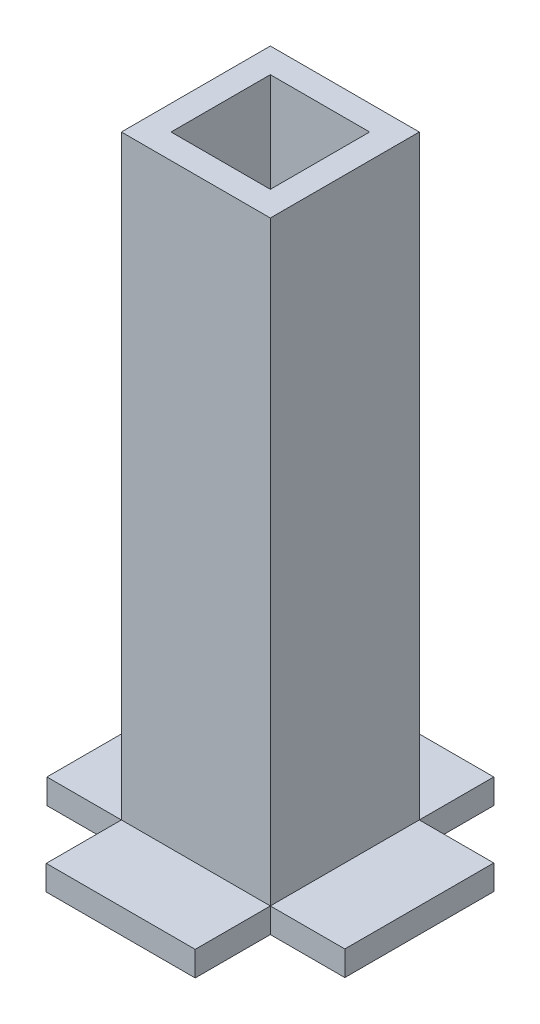
ISO-10303-21;
HEADER;
FILE_DESCRIPTION(('STEP AP214'),'2;1');
FILE_NAME('part.step','',(''),(''),'','','');
FILE_SCHEMA(('AUTOMOTIVE_DESIGN { 1 0 10303 214 1 1 1 1 }'));
ENDSEC;
DATA;
#1=APPLICATION_CONTEXT('core data for automotive mechanical design processes');
#2=APPLICATION_PROTOCOL_DEFINITION('international standard','automotive_design',2000,#1);
#3=PRODUCT_CONTEXT('',#1,'mechanical');
#4=PRODUCT('Part','Part','',(#3));
#5=PRODUCT_RELATED_PRODUCT_CATEGORY('part','',(#4));
#6=PRODUCT_DEFINITION_FORMATION('','',#4);
#7=PRODUCT_DEFINITION_CONTEXT('part definition',#1,'design');
#8=PRODUCT_DEFINITION('design','',#6,#7);
#9=PRODUCT_DEFINITION_SHAPE('','',#8);
#10=(LENGTH_UNIT() NAMED_UNIT(*) SI_UNIT(.MILLI.,.METRE.));
#11=(NAMED_UNIT(*) PLANE_ANGLE_UNIT() SI_UNIT($,.RADIAN.));
#12=(NAMED_UNIT(*) SI_UNIT($,.STERADIAN.) SOLID_ANGLE_UNIT());
#13=UNCERTAINTY_MEASURE_WITH_UNIT(LENGTH_MEASURE(1.E-05),#10,'distance_accuracy_value','');
#14=(GEOMETRIC_REPRESENTATION_CONTEXT(3) GLOBAL_UNCERTAINTY_ASSIGNED_CONTEXT((#13)) GLOBAL_UNIT_ASSIGNED_CONTEXT((#10,
#11,#12)) REPRESENTATION_CONTEXT('',''));
#15=CARTESIAN_POINT('',(0.,0.,0.));
#16=DIRECTION('',(0.,0.,1.));
#17=DIRECTION('',(1.,0.,0.));
#18=AXIS2_PLACEMENT_3D('',#15,#16,#17);
#19=CARTESIAN_POINT('',(0.,250.,0.));
#20=DIRECTION('',(0.,0.,-1.));
#21=DIRECTION('',(-1.,0.,0.));
#22=AXIS2_PLACEMENT_3D('',#19,#20,#21);
#23=PLANE('',#22);
#24=DIRECTION('',(0.,-1.,0.));
#25=VECTOR('',#24,1.);
#26=CARTESIAN_POINT('',(0.,10.,0.));
#27=LINE('',#26,#25);
#28=CARTESIAN_POINT('',(0.,10.,0.));
#29=VERTEX_POINT('',#28);
#30=CARTESIAN_POINT('',(0.,0.,0.));
#31=VERTEX_POINT('',#30);
#32=EDGE_CURVE('E202',#29,#31,#27,.T.);
#33=ORIENTED_EDGE('',*,*,#32,.F.);
#34=DIRECTION('',(-1.,0.,0.));
#35=VECTOR('',#34,1.);
#36=CARTESIAN_POINT('',(0.,10.,0.));
#37=LINE('',#36,#35);
#38=CARTESIAN_POINT('',(-30.,10.,0.));
#39=VERTEX_POINT('',#38);
#40=EDGE_CURVE('E241',#29,#39,#37,.T.);
#41=ORIENTED_EDGE('',*,*,#40,.T.);
#42=DIRECTION('',(0.,-1.,0.));
#43=VECTOR('',#42,1.);
#44=CARTESIAN_POINT('',(-30.,10.,0.));
#45=LINE('',#44,#43);
#46=CARTESIAN_POINT('',(-30.,0.,0.));
#47=VERTEX_POINT('',#46);
#48=EDGE_CURVE('E243',#39,#47,#45,.T.);
#49=ORIENTED_EDGE('',*,*,#48,.T.);
#50=DIRECTION('',(1.,0.,0.));
#51=VECTOR('',#50,1.);
#52=CARTESIAN_POINT('',(0.,0.,0.));
#53=LINE('',#52,#51);
#54=EDGE_CURVE('E358',#47,#31,#53,.T.);
#55=ORIENTED_EDGE('',*,*,#54,.T.);
#56=EDGE_LOOP('',(#33,#41,#49,#55));
#57=FACE_BOUND('',#56,.T.);
#58=ADVANCED_FACE('F35',(#57),#23,.F.);
#59=DIRECTION('',(0.,-1.,0.));
#60=VECTOR('',#59,1.);
#61=CARTESIAN_POINT('',(0.,250.,0.));
#62=LINE('',#61,#60);
#63=CARTESIAN_POINT('',(0.,250.,0.));
#64=VERTEX_POINT('',#63);
#65=EDGE_CURVE('E44',#64,#29,#62,.T.);
#66=ORIENTED_EDGE('',*,*,#65,.T.);
#67=DIRECTION('',(1.,0.,0.));
#68=VECTOR('',#67,1.);
#69=CARTESIAN_POINT('',(0.,10.,0.));
#70=LINE('',#69,#68);
#71=CARTESIAN_POINT('',(60.,10.,0.));
#72=VERTEX_POINT('',#71);
#73=EDGE_CURVE('E207',#29,#72,#70,.T.);
#74=ORIENTED_EDGE('',*,*,#73,.T.);
#75=DIRECTION('',(0.,-1.,0.));
#76=VECTOR('',#75,1.);
#77=CARTESIAN_POINT('',(60.,250.,0.));
#78=LINE('',#77,#76);
#79=CARTESIAN_POINT('',(60.,250.,0.));
#80=VERTEX_POINT('',#79);
#81=EDGE_CURVE('E363',#80,#72,#78,.T.);
#82=ORIENTED_EDGE('',*,*,#81,.F.);
#83=DIRECTION('',(1.,0.,0.));
#84=VECTOR('',#83,1.);
#85=CARTESIAN_POINT('',(0.,250.,0.));
#86=LINE('',#85,#84);
#87=EDGE_CURVE('E351',#64,#80,#86,.T.);
#88=ORIENTED_EDGE('',*,*,#87,.F.);
#89=EDGE_LOOP('',(#66,#74,#82,#88));
#90=FACE_BOUND('',#89,.T.);
#91=ADVANCED_FACE('F406',(#90),#23,.F.);
#92=CARTESIAN_POINT('',(60.,250.,0.));
#93=DIRECTION('',(-1.,0.,0.));
#94=DIRECTION('',(0.,0.,1.));
#95=AXIS2_PLACEMENT_3D('',#92,#93,#94);
#96=PLANE('',#95);
#97=DIRECTION('',(0.,0.,1.));
#98=VECTOR('',#97,1.);
#99=CARTESIAN_POINT('',(60.,10.,0.));
#100=LINE('',#99,#98);
#101=CARTESIAN_POINT('',(60.,10.,-60.));
#102=VERTEX_POINT('',#101);
#103=EDGE_CURVE('E220',#102,#72,#100,.T.);
#104=ORIENTED_EDGE('',*,*,#103,.F.);
#105=DIRECTION('',(0.,-1.,0.));
#106=VECTOR('',#105,1.);
#107=CARTESIAN_POINT('',(60.,250.,-60.));
#108=LINE('',#107,#106);
#109=CARTESIAN_POINT('',(60.,250.,-60.));
#110=VERTEX_POINT('',#109);
#111=EDGE_CURVE('E39',#110,#102,#108,.T.);
#112=ORIENTED_EDGE('',*,*,#111,.F.);
#113=DIRECTION('',(0.,0.,-1.));
#114=VECTOR('',#113,1.);
#115=CARTESIAN_POINT('',(60.,250.,0.));
#116=LINE('',#115,#114);
#117=EDGE_CURVE('E348',#80,#110,#116,.T.);
#118=ORIENTED_EDGE('',*,*,#117,.F.);
#119=ORIENTED_EDGE('',*,*,#81,.T.);
#120=EDGE_LOOP('',(#104,#112,#118,#119));
#121=FACE_BOUND('',#120,.T.);
#122=ADVANCED_FACE('F410',(#121),#96,.F.);
#123=CARTESIAN_POINT('',(0.,250.,0.));
#124=DIRECTION('',(-1.,0.,0.));
#125=DIRECTION('',(0.,0.,1.));
#126=AXIS2_PLACEMENT_3D('',#123,#124,#125);
#127=PLANE('',#126);
#128=CARTESIAN_POINT('',(0.,173.5,-25.5));
#129=DIRECTION('',(-1.,0.,0.));
#130=DIRECTION('',(0.,0.,1.));
#131=AXIS2_PLACEMENT_3D('',#128,#129,#130);
#132=CIRCLE('',#131,2.00000000000001);
#133=CARTESIAN_POINT('',(0.,173.5,-23.5));
#134=VERTEX_POINT('',#133);
#135=EDGE_CURVE('E789',#134,#134,#132,.T.);
#136=ORIENTED_EDGE('',*,*,#135,.F.);
#137=EDGE_LOOP('',(#136));
#138=FACE_BOUND('',#137,.T.);
#139=CARTESIAN_POINT('',(0.,125.5,-34.5));
#140=DIRECTION('',(-1.,0.,0.));
#141=DIRECTION('',(0.,0.,1.));
#142=AXIS2_PLACEMENT_3D('',#139,#140,#141);
#143=CIRCLE('',#142,2.);
#144=CARTESIAN_POINT('',(0.,125.5,-32.5));
#145=VERTEX_POINT('',#144);
#146=EDGE_CURVE('E782',#145,#145,#143,.T.);
#147=ORIENTED_EDGE('',*,*,#146,.F.);
#148=EDGE_LOOP('',(#147));
#149=FACE_BOUND('',#148,.T.);
#150=CARTESIAN_POINT('',(0.,125.5,-25.5));
#151=DIRECTION('',(-1.,0.,0.));
#152=DIRECTION('',(0.,0.,1.));
#153=AXIS2_PLACEMENT_3D('',#150,#151,#152);
#154=CIRCLE('',#153,1.99999999999999);
#155=CARTESIAN_POINT('',(0.,125.5,-23.5));
#156=VERTEX_POINT('',#155);
#157=EDGE_CURVE('E794',#156,#156,#154,.T.);
#158=ORIENTED_EDGE('',*,*,#157,.F.);
#159=EDGE_LOOP('',(#158));
#160=FACE_BOUND('',#159,.T.);
#161=CARTESIAN_POINT('',(0.,173.5,-34.5));
#162=DIRECTION('',(-1.,0.,0.));
#163=DIRECTION('',(0.,0.,1.));
#164=AXIS2_PLACEMENT_3D('',#161,#162,#163);
#165=CIRCLE('',#164,2.);
#166=CARTESIAN_POINT('',(0.,173.5,-32.5));
#167=VERTEX_POINT('',#166);
#168=EDGE_CURVE('E774',#167,#167,#165,.T.);
#169=ORIENTED_EDGE('',*,*,#168,.F.);
#170=EDGE_LOOP('',(#169));
#171=FACE_BOUND('',#170,.T.);
#172=DIRECTION('',(0.,0.,-1.));
#173=VECTOR('',#172,1.);
#174=CARTESIAN_POINT('',(0.,129.,-40.));
#175=LINE('',#174,#173);
#176=CARTESIAN_POINT('',(0.,129.,-20.));
#177=VERTEX_POINT('',#176);
#178=CARTESIAN_POINT('',(0.,129.,-40.));
#179=VERTEX_POINT('',#178);
#180=EDGE_CURVE('E286',#177,#179,#175,.T.);
#181=ORIENTED_EDGE('',*,*,#180,.T.);
#182=DIRECTION('',(0.,1.,0.));
#183=VECTOR('',#182,1.);
#184=CARTESIAN_POINT('',(0.,170.,-40.));
#185=LINE('',#184,#183);
#186=CARTESIAN_POINT('',(0.,170.,-40.));
#187=VERTEX_POINT('',#186);
#188=EDGE_CURVE('E282',#179,#187,#185,.T.);
#189=ORIENTED_EDGE('',*,*,#188,.T.);
#190=DIRECTION('',(0.,0.,1.));
#191=VECTOR('',#190,1.);
#192=CARTESIAN_POINT('',(0.,170.,-40.));
#193=LINE('',#192,#191);
#194=CARTESIAN_POINT('',(0.,170.,-20.));
#195=VERTEX_POINT('',#194);
#196=EDGE_CURVE('E296',#187,#195,#193,.T.);
#197=ORIENTED_EDGE('',*,*,#196,.T.);
#198=DIRECTION('',(0.,-1.,0.));
#199=VECTOR('',#198,1.);
#200=CARTESIAN_POINT('',(0.,170.,-20.));
#201=LINE('',#200,#199);
#202=EDGE_CURVE('E299',#195,#177,#201,.T.);
#203=ORIENTED_EDGE('',*,*,#202,.T.);
#204=EDGE_LOOP('',(#181,#189,#197,#203));
#205=FACE_BOUND('',#204,.T.);
#206=DIRECTION('',(0.,-1.,0.));
#207=VECTOR('',#206,1.);
#208=CARTESIAN_POINT('',(0.,250.,-60.));
#209=LINE('',#208,#207);
#210=CARTESIAN_POINT('',(0.,250.,-60.));
#211=VERTEX_POINT('',#210);
#212=CARTESIAN_POINT('',(0.,10.,-60.));
#213=VERTEX_POINT('',#212);
#214=EDGE_CURVE('E11',#211,#213,#209,.T.);
#215=ORIENTED_EDGE('',*,*,#214,.T.);
#216=DIRECTION('',(0.,0.,1.));
#217=VECTOR('',#216,1.);
#218=CARTESIAN_POINT('',(0.,10.,0.));
#219=LINE('',#218,#217);
#220=EDGE_CURVE('E246',#213,#29,#219,.T.);
#221=ORIENTED_EDGE('',*,*,#220,.T.);
#222=ORIENTED_EDGE('',*,*,#65,.F.);
#223=DIRECTION('',(0.,0.,-1.));
#224=VECTOR('',#223,1.);
#225=CARTESIAN_POINT('',(0.,250.,0.));
#226=LINE('',#225,#224);
#227=EDGE_CURVE('E353',#64,#211,#226,.T.);
#228=ORIENTED_EDGE('',*,*,#227,.T.);
#229=EDGE_LOOP('',(#215,#221,#222,#228));
#230=FACE_BOUND('',#229,.T.);
#231=ADVANCED_FACE('F403',(#138,#149,#160,#171,#205,#230),#127,.T.);
#232=DIRECTION('',(0.,-1.,0.));
#233=VECTOR('',#232,1.);
#234=CARTESIAN_POINT('',(0.,10.,-60.));
#235=LINE('',#234,#233);
#236=CARTESIAN_POINT('',(0.,0.,-60.));
#237=VERTEX_POINT('',#236);
#238=EDGE_CURVE('E247',#213,#237,#235,.T.);
#239=ORIENTED_EDGE('',*,*,#238,.F.);
#240=DIRECTION('',(0.,0.,-1.));
#241=VECTOR('',#240,1.);
#242=CARTESIAN_POINT('',(0.,10.,0.));
#243=LINE('',#242,#241);
#244=CARTESIAN_POINT('',(0.,10.,-90.));
#245=VERTEX_POINT('',#244);
#246=EDGE_CURVE('E271',#213,#245,#243,.T.);
#247=ORIENTED_EDGE('',*,*,#246,.T.);
#248=DIRECTION('',(0.,-1.,0.));
#249=VECTOR('',#248,1.);
#250=CARTESIAN_POINT('',(0.,10.,-90.));
#251=LINE('',#250,#249);
#252=CARTESIAN_POINT('',(0.,0.,-90.));
#253=VERTEX_POINT('',#252);
#254=EDGE_CURVE('E274',#245,#253,#251,.T.);
#255=ORIENTED_EDGE('',*,*,#254,.T.);
#256=DIRECTION('',(0.,0.,-1.));
#257=VECTOR('',#256,1.);
#258=CARTESIAN_POINT('',(0.,0.,0.));
#259=LINE('',#258,#257);
#260=EDGE_CURVE('E349',#237,#253,#259,.T.);
#261=ORIENTED_EDGE('',*,*,#260,.F.);
#262=EDGE_LOOP('',(#239,#247,#255,#261));
#263=FACE_BOUND('',#262,.T.);
#264=ADVANCED_FACE('F385',(#263),#127,.T.);
#265=CARTESIAN_POINT('',(9.99999999999999,0.,-50.));
#266=DIRECTION('',(-1.,0.,0.));
#267=DIRECTION('',(0.,0.,1.));
#268=AXIS2_PLACEMENT_3D('',#265,#266,#267);
#269=PLANE('',#268);
#270=CARTESIAN_POINT('',(10.,173.5,-25.5));
#271=DIRECTION('',(-1.,0.,0.));
#272=DIRECTION('',(0.,0.,1.));
#273=AXIS2_PLACEMENT_3D('',#270,#271,#272);
#274=CIRCLE('',#273,2.00000000000001);
#275=CARTESIAN_POINT('',(10.,173.5,-23.5));
#276=VERTEX_POINT('',#275);
#277=EDGE_CURVE('E779',#276,#276,#274,.T.);
#278=ORIENTED_EDGE('',*,*,#277,.T.);
#279=EDGE_LOOP('',(#278));
#280=FACE_BOUND('',#279,.T.);
#281=CARTESIAN_POINT('',(10.,125.5,-34.5));
#282=DIRECTION('',(-1.,0.,0.));
#283=DIRECTION('',(0.,0.,1.));
#284=AXIS2_PLACEMENT_3D('',#281,#282,#283);
#285=CIRCLE('',#284,2.);
#286=CARTESIAN_POINT('',(10.,125.5,-32.5));
#287=VERTEX_POINT('',#286);
#288=EDGE_CURVE('E785',#287,#287,#285,.T.);
#289=ORIENTED_EDGE('',*,*,#288,.T.);
#290=EDGE_LOOP('',(#289));
#291=FACE_BOUND('',#290,.T.);
#292=CARTESIAN_POINT('',(10.,125.5,-25.5));
#293=DIRECTION('',(-1.,0.,0.));
#294=DIRECTION('',(0.,0.,1.));
#295=AXIS2_PLACEMENT_3D('',#292,#293,#294);
#296=CIRCLE('',#295,1.99999999999999);
#297=CARTESIAN_POINT('',(10.,125.5,-23.5));
#298=VERTEX_POINT('',#297);
#299=EDGE_CURVE('E786',#298,#298,#296,.T.);
#300=ORIENTED_EDGE('',*,*,#299,.T.);
#301=EDGE_LOOP('',(#300));
#302=FACE_BOUND('',#301,.T.);
#303=CARTESIAN_POINT('',(10.,173.5,-34.5));
#304=DIRECTION('',(-1.,0.,0.));
#305=DIRECTION('',(0.,0.,1.));
#306=AXIS2_PLACEMENT_3D('',#303,#304,#305);
#307=CIRCLE('',#306,2.);
#308=CARTESIAN_POINT('',(10.,173.5,-32.5));
#309=VERTEX_POINT('',#308);
#310=EDGE_CURVE('E772',#309,#309,#307,.T.);
#311=ORIENTED_EDGE('',*,*,#310,.T.);
#312=EDGE_LOOP('',(#311));
#313=FACE_BOUND('',#312,.T.);
#314=DIRECTION('',(0.,0.,1.));
#315=VECTOR('',#314,1.);
#316=CARTESIAN_POINT('',(9.99999999999999,250.,-50.));
#317=LINE('',#316,#315);
#318=CARTESIAN_POINT('',(9.99999999999999,250.,-50.));
#319=VERTEX_POINT('',#318);
#320=CARTESIAN_POINT('',(10.,250.,-10.));
#321=VERTEX_POINT('',#320);
#322=EDGE_CURVE('E318',#319,#321,#317,.T.);
#323=ORIENTED_EDGE('',*,*,#322,.T.);
#324=DIRECTION('',(0.,1.,0.));
#325=VECTOR('',#324,1.);
#326=CARTESIAN_POINT('',(10.,0.,-10.));
#327=LINE('',#326,#325);
#328=CARTESIAN_POINT('',(10.,0.,-10.));
#329=VERTEX_POINT('',#328);
#330=EDGE_CURVE('E336',#329,#321,#327,.T.);
#331=ORIENTED_EDGE('',*,*,#330,.F.);
#332=DIRECTION('',(0.,0.,1.));
#333=VECTOR('',#332,1.);
#334=CARTESIAN_POINT('',(9.99999999999999,0.,-50.));
#335=LINE('',#334,#333);
#336=CARTESIAN_POINT('',(9.99999999999999,0.,-50.));
#337=VERTEX_POINT('',#336);
#338=EDGE_CURVE('E323',#337,#329,#335,.T.);
#339=ORIENTED_EDGE('',*,*,#338,.F.);
#340=DIRECTION('',(0.,1.,0.));
#341=VECTOR('',#340,1.);
#342=CARTESIAN_POINT('',(9.99999999999999,0.,-50.));
#343=LINE('',#342,#341);
#344=EDGE_CURVE('E339',#337,#319,#343,.T.);
#345=ORIENTED_EDGE('',*,*,#344,.T.);
#346=EDGE_LOOP('',(#323,#331,#339,#345));
#347=FACE_BOUND('',#346,.T.);
#348=DIRECTION('',(0.,1.,0.));
#349=VECTOR('',#348,1.);
#350=CARTESIAN_POINT('',(10.,170.,-40.));
#351=LINE('',#350,#349);
#352=CARTESIAN_POINT('',(10.,129.,-40.));
#353=VERTEX_POINT('',#352);
#354=CARTESIAN_POINT('',(10.,170.,-40.));
#355=VERTEX_POINT('',#354);
#356=EDGE_CURVE('E283',#353,#355,#351,.T.);
#357=ORIENTED_EDGE('',*,*,#356,.F.);
#358=DIRECTION('',(0.,0.,-1.));
#359=VECTOR('',#358,1.);
#360=CARTESIAN_POINT('',(10.,129.,-40.));
#361=LINE('',#360,#359);
#362=CARTESIAN_POINT('',(10.,129.,-20.));
#363=VERTEX_POINT('',#362);
#364=EDGE_CURVE('E291',#363,#353,#361,.T.);
#365=ORIENTED_EDGE('',*,*,#364,.F.);
#366=DIRECTION('',(0.,-1.,0.));
#367=VECTOR('',#366,1.);
#368=CARTESIAN_POINT('',(10.,170.,-20.));
#369=LINE('',#368,#367);
#370=CARTESIAN_POINT('',(10.,170.,-20.));
#371=VERTEX_POINT('',#370);
#372=EDGE_CURVE('E288',#371,#363,#369,.T.);
#373=ORIENTED_EDGE('',*,*,#372,.F.);
#374=DIRECTION('',(0.,0.,1.));
#375=VECTOR('',#374,1.);
#376=CARTESIAN_POINT('',(10.,170.,-40.));
#377=LINE('',#376,#375);
#378=EDGE_CURVE('E285',#355,#371,#377,.T.);
#379=ORIENTED_EDGE('',*,*,#378,.F.);
#380=EDGE_LOOP('',(#357,#365,#373,#379));
#381=FACE_BOUND('',#380,.T.);
#382=ADVANCED_FACE('F433',(#280,#291,#302,#313,#347,#381),#269,.F.);
#383=CARTESIAN_POINT('',(0.,250.,-60.));
#384=DIRECTION('',(0.,0.,-1.));
#385=DIRECTION('',(-1.,0.,0.));
#386=AXIS2_PLACEMENT_3D('',#383,#384,#385);
#387=PLANE('',#386);
#388=DIRECTION('',(1.,0.,0.));
#389=VECTOR('',#388,1.);
#390=CARTESIAN_POINT('',(0.,10.,-60.));
#391=LINE('',#390,#389);
#392=EDGE_CURVE('E263',#213,#102,#391,.T.);
#393=ORIENTED_EDGE('',*,*,#392,.F.);
#394=ORIENTED_EDGE('',*,*,#214,.F.);
#395=DIRECTION('',(1.,0.,0.));
#396=VECTOR('',#395,1.);
#397=CARTESIAN_POINT('',(0.,250.,-60.));
#398=LINE('',#397,#396);
#399=EDGE_CURVE('E345',#211,#110,#398,.T.);
#400=ORIENTED_EDGE('',*,*,#399,.T.);
#401=ORIENTED_EDGE('',*,*,#111,.T.);
#402=EDGE_LOOP('',(#393,#394,#400,#401));
#403=FACE_BOUND('',#402,.T.);
#404=ADVANCED_FACE('F37',(#403),#387,.T.);
#405=DIRECTION('',(1.,0.,0.));
#406=VECTOR('',#405,1.);
#407=CARTESIAN_POINT('',(0.,10.,0.));
#408=LINE('',#407,#406);
#409=CARTESIAN_POINT('',(90.,10.,0.));
#410=VERTEX_POINT('',#409);
#411=EDGE_CURVE('E230',#72,#410,#408,.T.);
#412=ORIENTED_EDGE('',*,*,#411,.F.);
#413=DIRECTION('',(0.,-1.,0.));
#414=VECTOR('',#413,1.);
#415=CARTESIAN_POINT('',(60.,10.,0.));
#416=LINE('',#415,#414);
#417=CARTESIAN_POINT('',(60.,0.,0.));
#418=VERTEX_POINT('',#417);
#419=EDGE_CURVE('E190',#72,#418,#416,.T.);
#420=ORIENTED_EDGE('',*,*,#419,.T.);
#421=CARTESIAN_POINT('',(90.,0.,0.));
#422=VERTEX_POINT('',#421);
#423=EDGE_CURVE('E357',#418,#422,#53,.T.);
#424=ORIENTED_EDGE('',*,*,#423,.T.);
#425=DIRECTION('',(0.,-1.,0.));
#426=VECTOR('',#425,1.);
#427=CARTESIAN_POINT('',(90.,10.,0.));
#428=LINE('',#427,#426);
#429=EDGE_CURVE('E221',#410,#422,#428,.T.);
#430=ORIENTED_EDGE('',*,*,#429,.F.);
#431=EDGE_LOOP('',(#412,#420,#424,#430));
#432=FACE_BOUND('',#431,.T.);
#433=ADVANCED_FACE('F419',(#432),#23,.F.);
#434=DIRECTION('',(0.,0.,-1.));
#435=VECTOR('',#434,1.);
#436=CARTESIAN_POINT('',(60.,10.,0.));
#437=LINE('',#436,#435);
#438=CARTESIAN_POINT('',(60.,10.,-90.));
#439=VERTEX_POINT('',#438);
#440=EDGE_CURVE('E266',#102,#439,#437,.T.);
#441=ORIENTED_EDGE('',*,*,#440,.F.);
#442=DIRECTION('',(0.,-1.,0.));
#443=VECTOR('',#442,1.);
#444=CARTESIAN_POINT('',(60.,10.,-60.));
#445=LINE('',#444,#443);
#446=CARTESIAN_POINT('',(60.,0.,-60.));
#447=VERTEX_POINT('',#446);
#448=EDGE_CURVE('E217',#102,#447,#445,.T.);
#449=ORIENTED_EDGE('',*,*,#448,.T.);
#450=DIRECTION('',(0.,0.,-1.));
#451=VECTOR('',#450,1.);
#452=CARTESIAN_POINT('',(60.,0.,0.));
#453=LINE('',#452,#451);
#454=CARTESIAN_POINT('',(60.,0.,-90.));
#455=VERTEX_POINT('',#454);
#456=EDGE_CURVE('E338',#447,#455,#453,.T.);
#457=ORIENTED_EDGE('',*,*,#456,.T.);
#458=DIRECTION('',(0.,-1.,0.));
#459=VECTOR('',#458,1.);
#460=CARTESIAN_POINT('',(60.,10.,-90.));
#461=LINE('',#460,#459);
#462=EDGE_CURVE('E279',#439,#455,#461,.T.);
#463=ORIENTED_EDGE('',*,*,#462,.F.);
#464=EDGE_LOOP('',(#441,#449,#457,#463));
#465=FACE_BOUND('',#464,.T.);
#466=ADVANCED_FACE('F377',(#465),#96,.F.);
#467=CARTESIAN_POINT('',(0.,250.,0.));
#468=DIRECTION('',(0.,1.,0.));
#469=DIRECTION('',(0.,0.,1.));
#470=AXIS2_PLACEMENT_3D('',#467,#468,#469);
#471=PLANE('',#470);
#472=DIRECTION('',(1.,0.,0.));
#473=VECTOR('',#472,1.);
#474=CARTESIAN_POINT('',(10.,250.,-10.));
#475=LINE('',#474,#473);
#476=CARTESIAN_POINT('',(50.,250.,-10.));
#477=VERTEX_POINT('',#476);
#478=EDGE_CURVE('E313',#321,#477,#475,.T.);
#479=ORIENTED_EDGE('',*,*,#478,.F.);
#480=ORIENTED_EDGE('',*,*,#322,.F.);
#481=DIRECTION('',(1.,0.,0.));
#482=VECTOR('',#481,1.);
#483=CARTESIAN_POINT('',(9.99999999999999,250.,-50.));
#484=LINE('',#483,#482);
#485=CARTESIAN_POINT('',(50.,250.,-50.));
#486=VERTEX_POINT('',#485);
#487=EDGE_CURVE('E331',#319,#486,#484,.T.);
#488=ORIENTED_EDGE('',*,*,#487,.T.);
#489=DIRECTION('',(0.,0.,1.));
#490=VECTOR('',#489,1.);
#491=CARTESIAN_POINT('',(50.,250.,-50.));
#492=LINE('',#491,#490);
#493=EDGE_CURVE('E328',#486,#477,#492,.T.);
#494=ORIENTED_EDGE('',*,*,#493,.T.);
#495=EDGE_LOOP('',(#479,#480,#488,#494));
#496=FACE_BOUND('',#495,.T.);
#497=ORIENTED_EDGE('',*,*,#399,.F.);
#498=ORIENTED_EDGE('',*,*,#227,.F.);
#499=ORIENTED_EDGE('',*,*,#87,.T.);
#500=ORIENTED_EDGE('',*,*,#117,.T.);
#501=EDGE_LOOP('',(#497,#498,#499,#500));
#502=FACE_BOUND('',#501,.T.);
#503=ADVANCED_FACE('F409',(#496,#502),#471,.T.);
#504=CARTESIAN_POINT('',(0.,0.,0.));
#505=DIRECTION('',(0.,1.,0.));
#506=DIRECTION('',(0.,0.,1.));
#507=AXIS2_PLACEMENT_3D('',#504,#505,#506);
#508=PLANE('',#507);
#509=ORIENTED_EDGE('',*,*,#338,.T.);
#510=DIRECTION('',(1.,0.,0.));
#511=VECTOR('',#510,1.);
#512=CARTESIAN_POINT('',(10.,0.,-10.));
#513=LINE('',#512,#511);
#514=CARTESIAN_POINT('',(50.,0.,-10.));
#515=VERTEX_POINT('',#514);
#516=EDGE_CURVE('E314',#329,#515,#513,.T.);
#517=ORIENTED_EDGE('',*,*,#516,.T.);
#518=DIRECTION('',(0.,0.,1.));
#519=VECTOR('',#518,1.);
#520=CARTESIAN_POINT('',(50.,0.,-50.));
#521=LINE('',#520,#519);
#522=CARTESIAN_POINT('',(50.,0.,-50.));
#523=VERTEX_POINT('',#522);
#524=EDGE_CURVE('E317',#523,#515,#521,.T.);
#525=ORIENTED_EDGE('',*,*,#524,.F.);
#526=DIRECTION('',(1.,0.,0.));
#527=VECTOR('',#526,1.);
#528=CARTESIAN_POINT('',(9.99999999999999,0.,-50.));
#529=LINE('',#528,#527);
#530=EDGE_CURVE('E320',#337,#523,#529,.T.);
#531=ORIENTED_EDGE('',*,*,#530,.F.);
#532=EDGE_LOOP('',(#509,#517,#525,#531));
#533=FACE_BOUND('',#532,.T.);
#534=ORIENTED_EDGE('',*,*,#54,.F.);
#535=DIRECTION('',(0.,0.,1.));
#536=VECTOR('',#535,1.);
#537=CARTESIAN_POINT('',(-30.,0.,0.));
#538=LINE('',#537,#536);
#539=CARTESIAN_POINT('',(-30.,0.,-60.));
#540=VERTEX_POINT('',#539);
#541=EDGE_CURVE('E242',#540,#47,#538,.T.);
#542=ORIENTED_EDGE('',*,*,#541,.F.);
#543=DIRECTION('',(-1.,0.,0.));
#544=VECTOR('',#543,1.);
#545=CARTESIAN_POINT('',(0.,0.,-60.));
#546=LINE('',#545,#544);
#547=EDGE_CURVE('E226',#237,#540,#546,.T.);
#548=ORIENTED_EDGE('',*,*,#547,.F.);
#549=ORIENTED_EDGE('',*,*,#260,.T.);
#550=DIRECTION('',(1.,0.,0.));
#551=VECTOR('',#550,1.);
#552=CARTESIAN_POINT('',(0.,0.,-90.));
#553=LINE('',#552,#551);
#554=EDGE_CURVE('E260',#253,#455,#553,.T.);
#555=ORIENTED_EDGE('',*,*,#554,.T.);
#556=ORIENTED_EDGE('',*,*,#456,.F.);
#557=DIRECTION('',(1.,0.,0.));
#558=VECTOR('',#557,1.);
#559=CARTESIAN_POINT('',(0.,0.,-60.));
#560=LINE('',#559,#558);
#561=CARTESIAN_POINT('',(90.,0.,-60.));
#562=VERTEX_POINT('',#561);
#563=EDGE_CURVE('E60',#447,#562,#560,.T.);
#564=ORIENTED_EDGE('',*,*,#563,.T.);
#565=DIRECTION('',(0.,0.,1.));
#566=VECTOR('',#565,1.);
#567=CARTESIAN_POINT('',(90.,0.,0.));
#568=LINE('',#567,#566);
#569=EDGE_CURVE('E227',#562,#422,#568,.T.);
#570=ORIENTED_EDGE('',*,*,#569,.T.);
#571=ORIENTED_EDGE('',*,*,#423,.F.);
#572=DIRECTION('',(0.,0.,-1.));
#573=VECTOR('',#572,1.);
#574=CARTESIAN_POINT('',(60.,0.,0.));
#575=LINE('',#574,#573);
#576=CARTESIAN_POINT('',(60.,0.,30.2750280168843));
#577=VERTEX_POINT('',#576);
#578=EDGE_CURVE('E52',#577,#418,#575,.T.);
#579=ORIENTED_EDGE('',*,*,#578,.F.);
#580=DIRECTION('',(1.,0.,0.));
#581=VECTOR('',#580,1.);
#582=CARTESIAN_POINT('',(0.,0.,30.2750280168843));
#583=LINE('',#582,#581);
#584=CARTESIAN_POINT('',(0.,0.,30.2750280168843));
#585=VERTEX_POINT('',#584);
#586=EDGE_CURVE('E206',#585,#577,#583,.T.);
#587=ORIENTED_EDGE('',*,*,#586,.F.);
#588=DIRECTION('',(0.,0.,-1.));
#589=VECTOR('',#588,1.);
#590=CARTESIAN_POINT('',(0.,0.,0.));
#591=LINE('',#590,#589);
#592=EDGE_CURVE('E193',#585,#31,#591,.T.);
#593=ORIENTED_EDGE('',*,*,#592,.T.);
#594=EDGE_LOOP('',(#534,#542,#548,#549,#555,#556,#564,#570,#571,#579,#587,#593));
#595=FACE_BOUND('',#594,.T.);
#596=ADVANCED_FACE('F394',(#533,#595),#508,.F.);
#597=CARTESIAN_POINT('',(10.,0.,-10.));
#598=DIRECTION('',(0.,0.,1.));
#599=DIRECTION('',(1.,0.,0.));
#600=AXIS2_PLACEMENT_3D('',#597,#598,#599);
#601=PLANE('',#600);
#602=ORIENTED_EDGE('',*,*,#478,.T.);
#603=DIRECTION('',(0.,1.,0.));
#604=VECTOR('',#603,1.);
#605=CARTESIAN_POINT('',(50.,0.,-10.));
#606=LINE('',#605,#604);
#607=EDGE_CURVE('E326',#515,#477,#606,.T.);
#608=ORIENTED_EDGE('',*,*,#607,.F.);
#609=ORIENTED_EDGE('',*,*,#516,.F.);
#610=ORIENTED_EDGE('',*,*,#330,.T.);
#611=EDGE_LOOP('',(#602,#608,#609,#610));
#612=FACE_BOUND('',#611,.T.);
#613=ADVANCED_FACE('F478',(#612),#601,.F.);
#614=CARTESIAN_POINT('',(9.99999999999999,0.,-50.));
#615=DIRECTION('',(0.,0.,1.));
#616=DIRECTION('',(1.,0.,0.));
#617=AXIS2_PLACEMENT_3D('',#614,#615,#616);
#618=PLANE('',#617);
#619=ORIENTED_EDGE('',*,*,#487,.F.);
#620=ORIENTED_EDGE('',*,*,#344,.F.);
#621=ORIENTED_EDGE('',*,*,#530,.T.);
#622=DIRECTION('',(0.,1.,0.));
#623=VECTOR('',#622,1.);
#624=CARTESIAN_POINT('',(50.,0.,-50.));
#625=LINE('',#624,#623);
#626=EDGE_CURVE('E341',#523,#486,#625,.T.);
#627=ORIENTED_EDGE('',*,*,#626,.T.);
#628=EDGE_LOOP('',(#619,#620,#621,#627));
#629=FACE_BOUND('',#628,.T.);
#630=ADVANCED_FACE('F475',(#629),#618,.T.);
#631=CARTESIAN_POINT('',(50.,0.,-50.));
#632=DIRECTION('',(-1.,0.,0.));
#633=DIRECTION('',(0.,0.,1.));
#634=AXIS2_PLACEMENT_3D('',#631,#632,#633);
#635=PLANE('',#634);
#636=ORIENTED_EDGE('',*,*,#493,.F.);
#637=ORIENTED_EDGE('',*,*,#626,.F.);
#638=ORIENTED_EDGE('',*,*,#524,.T.);
#639=ORIENTED_EDGE('',*,*,#607,.T.);
#640=EDGE_LOOP('',(#636,#637,#638,#639));
#641=FACE_BOUND('',#640,.T.);
#642=ADVANCED_FACE('F470',(#641),#635,.T.);
#643=CARTESIAN_POINT('',(10.,170.,-40.));
#644=DIRECTION('',(0.,0.,1.));
#645=DIRECTION('',(1.,0.,0.));
#646=AXIS2_PLACEMENT_3D('',#643,#644,#645);
#647=PLANE('',#646);
#648=ORIENTED_EDGE('',*,*,#188,.F.);
#649=DIRECTION('',(-1.,0.,0.));
#650=VECTOR('',#649,1.);
#651=CARTESIAN_POINT('',(10.,129.,-40.));
#652=LINE('',#651,#650);
#653=EDGE_CURVE('E293',#353,#179,#652,.T.);
#654=ORIENTED_EDGE('',*,*,#653,.F.);
#655=ORIENTED_EDGE('',*,*,#356,.T.);
#656=DIRECTION('',(-1.,0.,0.));
#657=VECTOR('',#656,1.);
#658=CARTESIAN_POINT('',(10.,170.,-40.));
#659=LINE('',#658,#657);
#660=EDGE_CURVE('E310',#355,#187,#659,.T.);
#661=ORIENTED_EDGE('',*,*,#660,.T.);
#662=EDGE_LOOP('',(#648,#654,#655,#661));
#663=FACE_BOUND('',#662,.T.);
#664=ADVANCED_FACE('F466',(#663),#647,.T.);
#665=CARTESIAN_POINT('',(10.,170.,-40.));
#666=DIRECTION('',(0.,-1.,0.));
#667=DIRECTION('',(0.,0.,-1.));
#668=AXIS2_PLACEMENT_3D('',#665,#666,#667);
#669=PLANE('',#668);
#670=ORIENTED_EDGE('',*,*,#196,.F.);
#671=ORIENTED_EDGE('',*,*,#660,.F.);
#672=ORIENTED_EDGE('',*,*,#378,.T.);
#673=DIRECTION('',(-1.,0.,0.));
#674=VECTOR('',#673,1.);
#675=CARTESIAN_POINT('',(10.,170.,-20.));
#676=LINE('',#675,#674);
#677=EDGE_CURVE('E308',#371,#195,#676,.T.);
#678=ORIENTED_EDGE('',*,*,#677,.T.);
#679=EDGE_LOOP('',(#670,#671,#672,#678));
#680=FACE_BOUND('',#679,.T.);
#681=ADVANCED_FACE('F462',(#680),#669,.T.);
#682=CARTESIAN_POINT('',(10.,170.,-20.));
#683=DIRECTION('',(0.,0.,-1.));
#684=DIRECTION('',(-1.,0.,0.));
#685=AXIS2_PLACEMENT_3D('',#682,#683,#684);
#686=PLANE('',#685);
#687=ORIENTED_EDGE('',*,*,#202,.F.);
#688=ORIENTED_EDGE('',*,*,#677,.F.);
#689=ORIENTED_EDGE('',*,*,#372,.T.);
#690=DIRECTION('',(-1.,0.,0.));
#691=VECTOR('',#690,1.);
#692=CARTESIAN_POINT('',(10.,129.,-20.));
#693=LINE('',#692,#691);
#694=EDGE_CURVE('E306',#363,#177,#693,.T.);
#695=ORIENTED_EDGE('',*,*,#694,.T.);
#696=EDGE_LOOP('',(#687,#688,#689,#695));
#697=FACE_BOUND('',#696,.T.);
#698=ADVANCED_FACE('F455',(#697),#686,.T.);
#699=CARTESIAN_POINT('',(10.,129.,-40.));
#700=DIRECTION('',(0.,1.,0.));
#701=DIRECTION('',(0.,0.,1.));
#702=AXIS2_PLACEMENT_3D('',#699,#700,#701);
#703=PLANE('',#702);
#704=ORIENTED_EDGE('',*,*,#180,.F.);
#705=ORIENTED_EDGE('',*,*,#694,.F.);
#706=ORIENTED_EDGE('',*,*,#364,.T.);
#707=ORIENTED_EDGE('',*,*,#653,.T.);
#708=EDGE_LOOP('',(#704,#705,#706,#707));
#709=FACE_BOUND('',#708,.T.);
#710=ADVANCED_FACE('F448',(#709),#703,.T.);
#711=CARTESIAN_POINT('',(0.,10.,-90.));
#712=DIRECTION('',(0.,0.,-1.));
#713=DIRECTION('',(-1.,0.,0.));
#714=AXIS2_PLACEMENT_3D('',#711,#712,#713);
#715=PLANE('',#714);
#716=ORIENTED_EDGE('',*,*,#554,.F.);
#717=ORIENTED_EDGE('',*,*,#254,.F.);
#718=DIRECTION('',(1.,0.,0.));
#719=VECTOR('',#718,1.);
#720=CARTESIAN_POINT('',(0.,10.,-90.));
#721=LINE('',#720,#719);
#722=EDGE_CURVE('E268',#245,#439,#721,.T.);
#723=ORIENTED_EDGE('',*,*,#722,.T.);
#724=ORIENTED_EDGE('',*,*,#462,.T.);
#725=EDGE_LOOP('',(#716,#717,#723,#724));
#726=FACE_BOUND('',#725,.T.);
#727=ADVANCED_FACE('F446',(#726),#715,.T.);
#728=CARTESIAN_POINT('',(0.,10.,0.));
#729=DIRECTION('',(0.,1.,0.));
#730=DIRECTION('',(0.,0.,1.));
#731=AXIS2_PLACEMENT_3D('',#728,#729,#730);
#732=PLANE('',#731);
#733=ORIENTED_EDGE('',*,*,#392,.T.);
#734=ORIENTED_EDGE('',*,*,#440,.T.);
#735=ORIENTED_EDGE('',*,*,#722,.F.);
#736=ORIENTED_EDGE('',*,*,#246,.F.);
#737=EDGE_LOOP('',(#733,#734,#735,#736));
#738=FACE_BOUND('',#737,.T.);
#739=ADVANCED_FACE('F382',(#738),#732,.T.);
#740=CARTESIAN_POINT('',(0.,10.,-60.));
#741=DIRECTION('',(0.,0.,1.));
#742=DIRECTION('',(1.,0.,0.));
#743=AXIS2_PLACEMENT_3D('',#740,#741,#742);
#744=PLANE('',#743);
#745=ORIENTED_EDGE('',*,*,#547,.T.);
#746=DIRECTION('',(0.,-1.,0.));
#747=VECTOR('',#746,1.);
#748=CARTESIAN_POINT('',(-30.,10.,-60.));
#749=LINE('',#748,#747);
#750=CARTESIAN_POINT('',(-30.,10.,-60.));
#751=VERTEX_POINT('',#750);
#752=EDGE_CURVE('E238',#751,#540,#749,.T.);
#753=ORIENTED_EDGE('',*,*,#752,.F.);
#754=DIRECTION('',(-1.,0.,0.));
#755=VECTOR('',#754,1.);
#756=CARTESIAN_POINT('',(0.,10.,-60.));
#757=LINE('',#756,#755);
#758=EDGE_CURVE('E255',#213,#751,#757,.T.);
#759=ORIENTED_EDGE('',*,*,#758,.F.);
#760=ORIENTED_EDGE('',*,*,#238,.T.);
#761=EDGE_LOOP('',(#745,#753,#759,#760));
#762=FACE_BOUND('',#761,.T.);
#763=ADVANCED_FACE('F390',(#762),#744,.F.);
#764=CARTESIAN_POINT('',(-30.,10.,0.));
#765=DIRECTION('',(1.,0.,0.));
#766=DIRECTION('',(0.,0.,-1.));
#767=AXIS2_PLACEMENT_3D('',#764,#765,#766);
#768=PLANE('',#767);
#769=ORIENTED_EDGE('',*,*,#541,.T.);
#770=ORIENTED_EDGE('',*,*,#48,.F.);
#771=DIRECTION('',(0.,0.,1.));
#772=VECTOR('',#771,1.);
#773=CARTESIAN_POINT('',(-30.,10.,0.));
#774=LINE('',#773,#772);
#775=EDGE_CURVE('E258',#751,#39,#774,.T.);
#776=ORIENTED_EDGE('',*,*,#775,.F.);
#777=ORIENTED_EDGE('',*,*,#752,.T.);
#778=EDGE_LOOP('',(#769,#770,#776,#777));
#779=FACE_BOUND('',#778,.T.);
#780=ADVANCED_FACE('F398',(#779),#768,.F.);
#781=CARTESIAN_POINT('',(0.,10.,0.));
#782=DIRECTION('',(0.,1.,0.));
#783=DIRECTION('',(0.,0.,1.));
#784=AXIS2_PLACEMENT_3D('',#781,#782,#783);
#785=PLANE('',#784);
#786=ORIENTED_EDGE('',*,*,#758,.T.);
#787=ORIENTED_EDGE('',*,*,#775,.T.);
#788=ORIENTED_EDGE('',*,*,#40,.F.);
#789=ORIENTED_EDGE('',*,*,#220,.F.);
#790=EDGE_LOOP('',(#786,#787,#788,#789));
#791=FACE_BOUND('',#790,.T.);
#792=ADVANCED_FACE('F401',(#791),#785,.T.);
#793=CARTESIAN_POINT('',(90.,10.,0.));
#794=DIRECTION('',(1.,0.,0.));
#795=DIRECTION('',(0.,0.,-1.));
#796=AXIS2_PLACEMENT_3D('',#793,#794,#795);
#797=PLANE('',#796);
#798=ORIENTED_EDGE('',*,*,#569,.F.);
#799=DIRECTION('',(0.,-1.,0.));
#800=VECTOR('',#799,1.);
#801=CARTESIAN_POINT('',(90.,10.,-60.));
#802=LINE('',#801,#800);
#803=CARTESIAN_POINT('',(90.,10.,-60.));
#804=VERTEX_POINT('',#803);
#805=EDGE_CURVE('E215',#804,#562,#802,.T.);
#806=ORIENTED_EDGE('',*,*,#805,.F.);
#807=DIRECTION('',(0.,0.,1.));
#808=VECTOR('',#807,1.);
#809=CARTESIAN_POINT('',(90.,10.,0.));
#810=LINE('',#809,#808);
#811=EDGE_CURVE('E224',#804,#410,#810,.T.);
#812=ORIENTED_EDGE('',*,*,#811,.T.);
#813=ORIENTED_EDGE('',*,*,#429,.T.);
#814=EDGE_LOOP('',(#798,#806,#812,#813));
#815=FACE_BOUND('',#814,.T.);
#816=ADVANCED_FACE('F444',(#815),#797,.T.);
#817=CARTESIAN_POINT('',(0.,10.,-60.));
#818=DIRECTION('',(0.,0.,-1.));
#819=DIRECTION('',(-1.,0.,0.));
#820=AXIS2_PLACEMENT_3D('',#817,#818,#819);
#821=PLANE('',#820);
#822=ORIENTED_EDGE('',*,*,#563,.F.);
#823=ORIENTED_EDGE('',*,*,#448,.F.);
#824=DIRECTION('',(1.,0.,0.));
#825=VECTOR('',#824,1.);
#826=CARTESIAN_POINT('',(0.,10.,-60.));
#827=LINE('',#826,#825);
#828=EDGE_CURVE('E218',#102,#804,#827,.T.);
#829=ORIENTED_EDGE('',*,*,#828,.T.);
#830=ORIENTED_EDGE('',*,*,#805,.T.);
#831=EDGE_LOOP('',(#822,#823,#829,#830));
#832=FACE_BOUND('',#831,.T.);
#833=ADVANCED_FACE('F441',(#832),#821,.T.);
#834=CARTESIAN_POINT('',(0.,10.,0.));
#835=DIRECTION('',(0.,1.,0.));
#836=DIRECTION('',(0.,0.,1.));
#837=AXIS2_PLACEMENT_3D('',#834,#835,#836);
#838=PLANE('',#837);
#839=ORIENTED_EDGE('',*,*,#811,.F.);
#840=ORIENTED_EDGE('',*,*,#828,.F.);
#841=ORIENTED_EDGE('',*,*,#103,.T.);
#842=ORIENTED_EDGE('',*,*,#411,.T.);
#843=EDGE_LOOP('',(#839,#840,#841,#842));
#844=FACE_BOUND('',#843,.T.);
#845=ADVANCED_FACE('F439',(#844),#838,.T.);
#846=CARTESIAN_POINT('',(0.,10.,30.2750280168843));
#847=DIRECTION('',(0.,0.,-1.));
#848=DIRECTION('',(-1.,0.,0.));
#849=AXIS2_PLACEMENT_3D('',#846,#847,#848);
#850=PLANE('',#849);
#851=ORIENTED_EDGE('',*,*,#586,.T.);
#852=DIRECTION('',(0.,-1.,0.));
#853=VECTOR('',#852,1.);
#854=CARTESIAN_POINT('',(60.,10.,30.2750280168843));
#855=LINE('',#854,#853);
#856=CARTESIAN_POINT('',(60.,10.,30.2750280168843));
#857=VERTEX_POINT('',#856);
#858=EDGE_CURVE('E188',#857,#577,#855,.T.);
#859=ORIENTED_EDGE('',*,*,#858,.F.);
#860=DIRECTION('',(1.,0.,0.));
#861=VECTOR('',#860,1.);
#862=CARTESIAN_POINT('',(0.,10.,30.2750280168843));
#863=LINE('',#862,#861);
#864=CARTESIAN_POINT('',(0.,10.,30.2750280168843));
#865=VERTEX_POINT('',#864);
#866=EDGE_CURVE('E194',#865,#857,#863,.T.);
#867=ORIENTED_EDGE('',*,*,#866,.F.);
#868=DIRECTION('',(0.,-1.,0.));
#869=VECTOR('',#868,1.);
#870=CARTESIAN_POINT('',(0.,10.,30.2750280168843));
#871=LINE('',#870,#869);
#872=EDGE_CURVE('E210',#865,#585,#871,.T.);
#873=ORIENTED_EDGE('',*,*,#872,.T.);
#874=EDGE_LOOP('',(#851,#859,#867,#873));
#875=FACE_BOUND('',#874,.T.);
#876=ADVANCED_FACE('F204',(#875),#850,.F.);
#877=CARTESIAN_POINT('',(60.,10.,0.));
#878=DIRECTION('',(-1.,0.,0.));
#879=DIRECTION('',(0.,0.,1.));
#880=AXIS2_PLACEMENT_3D('',#877,#878,#879);
#881=PLANE('',#880);
#882=ORIENTED_EDGE('',*,*,#578,.T.);
#883=ORIENTED_EDGE('',*,*,#419,.F.);
#884=DIRECTION('',(0.,0.,-1.));
#885=VECTOR('',#884,1.);
#886=CARTESIAN_POINT('',(60.,10.,0.));
#887=LINE('',#886,#885);
#888=EDGE_CURVE('E184',#857,#72,#887,.T.);
#889=ORIENTED_EDGE('',*,*,#888,.F.);
#890=ORIENTED_EDGE('',*,*,#858,.T.);
#891=EDGE_LOOP('',(#882,#883,#889,#890));
#892=FACE_BOUND('',#891,.T.);
#893=ADVANCED_FACE('F186',(#892),#881,.F.);
#894=CARTESIAN_POINT('',(0.,10.,0.));
#895=DIRECTION('',(-1.,0.,0.));
#896=DIRECTION('',(0.,0.,1.));
#897=AXIS2_PLACEMENT_3D('',#894,#895,#896);
#898=PLANE('',#897);
#899=ORIENTED_EDGE('',*,*,#592,.F.);
#900=ORIENTED_EDGE('',*,*,#872,.F.);
#901=DIRECTION('',(0.,0.,-1.));
#902=VECTOR('',#901,1.);
#903=CARTESIAN_POINT('',(0.,10.,0.));
#904=LINE('',#903,#902);
#905=EDGE_CURVE('E200',#865,#29,#904,.T.);
#906=ORIENTED_EDGE('',*,*,#905,.T.);
#907=ORIENTED_EDGE('',*,*,#32,.T.);
#908=EDGE_LOOP('',(#899,#900,#906,#907));
#909=FACE_BOUND('',#908,.T.);
#910=ADVANCED_FACE('F556',(#909),#898,.T.);
#911=CARTESIAN_POINT('',(0.,10.,0.));
#912=DIRECTION('',(0.,1.,0.));
#913=DIRECTION('',(0.,0.,1.));
#914=AXIS2_PLACEMENT_3D('',#911,#912,#913);
#915=PLANE('',#914);
#916=ORIENTED_EDGE('',*,*,#866,.T.);
#917=ORIENTED_EDGE('',*,*,#888,.T.);
#918=ORIENTED_EDGE('',*,*,#73,.F.);
#919=ORIENTED_EDGE('',*,*,#905,.F.);
#920=EDGE_LOOP('',(#916,#917,#918,#919));
#921=FACE_BOUND('',#920,.T.);
#922=ADVANCED_FACE('F198',(#921),#915,.T.);
#923=CARTESIAN_POINT('',(10.,173.5,-34.5));
#924=DIRECTION('',(-1.,0.,0.));
#925=DIRECTION('',(0.,0.,1.));
#926=AXIS2_PLACEMENT_3D('',#923,#924,#925);
#927=CYLINDRICAL_SURFACE('',#926,2.);
#928=ORIENTED_EDGE('',*,*,#310,.F.);
#929=EDGE_LOOP('',(#928));
#930=FACE_BOUND('',#929,.T.);
#931=ORIENTED_EDGE('',*,*,#168,.T.);
#932=EDGE_LOOP('',(#931));
#933=FACE_BOUND('',#932,.T.);
#934=ADVANCED_FACE('F513',(#930,#933),#927,.F.);
#935=CARTESIAN_POINT('',(10.,125.5,-25.5));
#936=DIRECTION('',(-1.,0.,0.));
#937=DIRECTION('',(0.,0.,1.));
#938=AXIS2_PLACEMENT_3D('',#935,#936,#937);
#939=CYLINDRICAL_SURFACE('',#938,1.99999999999999);
#940=ORIENTED_EDGE('',*,*,#299,.F.);
#941=EDGE_LOOP('',(#940));
#942=FACE_BOUND('',#941,.T.);
#943=ORIENTED_EDGE('',*,*,#157,.T.);
#944=EDGE_LOOP('',(#943));
#945=FACE_BOUND('',#944,.T.);
#946=ADVANCED_FACE('F518',(#942,#945),#939,.F.);
#947=CARTESIAN_POINT('',(10.,125.5,-34.5));
#948=DIRECTION('',(-1.,0.,0.));
#949=DIRECTION('',(0.,0.,1.));
#950=AXIS2_PLACEMENT_3D('',#947,#948,#949);
#951=CYLINDRICAL_SURFACE('',#950,2.);
#952=ORIENTED_EDGE('',*,*,#288,.F.);
#953=EDGE_LOOP('',(#952));
#954=FACE_BOUND('',#953,.T.);
#955=ORIENTED_EDGE('',*,*,#146,.T.);
#956=EDGE_LOOP('',(#955));
#957=FACE_BOUND('',#956,.T.);
#958=ADVANCED_FACE('F528',(#954,#957),#951,.F.);
#959=CARTESIAN_POINT('',(10.,173.5,-25.5));
#960=DIRECTION('',(-1.,0.,0.));
#961=DIRECTION('',(0.,0.,1.));
#962=AXIS2_PLACEMENT_3D('',#959,#960,#961);
#963=CYLINDRICAL_SURFACE('',#962,2.00000000000001);
#964=ORIENTED_EDGE('',*,*,#277,.F.);
#965=EDGE_LOOP('',(#964));
#966=FACE_BOUND('',#965,.T.);
#967=ORIENTED_EDGE('',*,*,#135,.T.);
#968=EDGE_LOOP('',(#967));
#969=FACE_BOUND('',#968,.T.);
#970=ADVANCED_FACE('F538',(#966,#969),#963,.F.);
#971=CLOSED_SHELL('',(#58,#91,#122,#231,#264,#382,#404,#433,#466,#503,#596,#613,#630,#642,#664,
#681,#698,#710,#727,#739,#763,#780,#792,#816,#833,#845,#876,#893,#910,#922,#934,#946,#958,#970));
#972=MANIFOLD_SOLID_BREP('B2',#971);
#973=ADVANCED_BREP_SHAPE_REPRESENTATION('',(#18,#972),#14);
#974=SHAPE_DEFINITION_REPRESENTATION(#9,#973);
ENDSEC;
END-ISO-10303-21;
